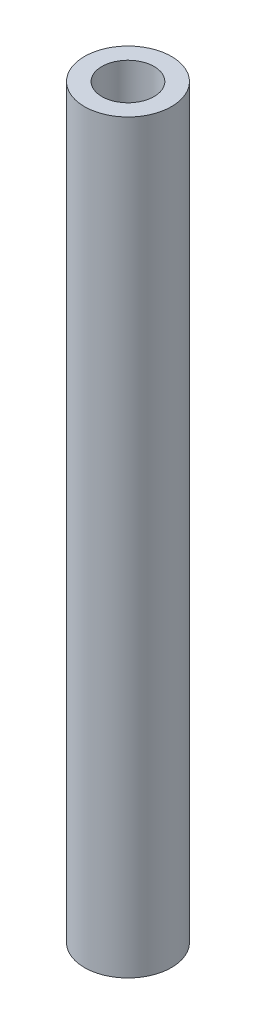
ISO-10303-21;
HEADER;
FILE_DESCRIPTION(('STEP AP214'),'2;1');
FILE_NAME('part.step','',(''),(''),'','','');
FILE_SCHEMA(('AUTOMOTIVE_DESIGN { 1 0 10303 214 1 1 1 1 }'));
ENDSEC;
DATA;
#1=APPLICATION_CONTEXT('core data for automotive mechanical design processes');
#2=APPLICATION_PROTOCOL_DEFINITION('international standard','automotive_design',2000,#1);
#3=PRODUCT_CONTEXT('',#1,'mechanical');
#4=PRODUCT('Part','Part','',(#3));
#5=PRODUCT_RELATED_PRODUCT_CATEGORY('part','',(#4));
#6=PRODUCT_DEFINITION_FORMATION('','',#4);
#7=PRODUCT_DEFINITION_CONTEXT('part definition',#1,'design');
#8=PRODUCT_DEFINITION('design','',#6,#7);
#9=PRODUCT_DEFINITION_SHAPE('','',#8);
#10=(LENGTH_UNIT() NAMED_UNIT(*) SI_UNIT(.MILLI.,.METRE.));
#11=(NAMED_UNIT(*) PLANE_ANGLE_UNIT() SI_UNIT($,.RADIAN.));
#12=(NAMED_UNIT(*) SI_UNIT($,.STERADIAN.) SOLID_ANGLE_UNIT());
#13=UNCERTAINTY_MEASURE_WITH_UNIT(LENGTH_MEASURE(1.E-05),#10,'distance_accuracy_value','');
#14=(GEOMETRIC_REPRESENTATION_CONTEXT(3) GLOBAL_UNCERTAINTY_ASSIGNED_CONTEXT((#13)) GLOBAL_UNIT_ASSIGNED_CONTEXT((#10,
#11,#12)) REPRESENTATION_CONTEXT('',''));
#15=CARTESIAN_POINT('',(0.,0.,0.));
#16=DIRECTION('',(0.,0.,1.));
#17=DIRECTION('',(1.,0.,0.));
#18=AXIS2_PLACEMENT_3D('',#15,#16,#17);
#19=CARTESIAN_POINT('',(0.,60.,0.));
#20=DIRECTION('',(0.,1.,0.));
#21=DIRECTION('',(0.,0.,1.));
#22=AXIS2_PLACEMENT_3D('',#19,#20,#21);
#23=PLANE('',#22);
#24=CARTESIAN_POINT('',(0.,60.,0.));
#25=DIRECTION('',(0.,1.,0.));
#26=DIRECTION('',(0.,0.,1.));
#27=AXIS2_PLACEMENT_3D('',#24,#25,#26);
#28=CIRCLE('',#27,3.5);
#29=CARTESIAN_POINT('',(0.,60.,3.5));
#30=VERTEX_POINT('',#29);
#31=EDGE_CURVE('E10',#30,#30,#28,.T.);
#32=ORIENTED_EDGE('',*,*,#31,.T.);
#33=EDGE_LOOP('',(#32));
#34=FACE_BOUND('',#33,.T.);
#35=CARTESIAN_POINT('',(0.,60.,0.));
#36=DIRECTION('',(0.,1.,0.));
#37=DIRECTION('',(0.,0.,1.));
#38=AXIS2_PLACEMENT_3D('',#35,#36,#37);
#39=CIRCLE('',#38,2.1);
#40=CARTESIAN_POINT('',(0.,60.,2.1));
#41=VERTEX_POINT('',#40);
#42=EDGE_CURVE('E49',#41,#41,#39,.T.);
#43=ORIENTED_EDGE('',*,*,#42,.F.);
#44=EDGE_LOOP('',(#43));
#45=FACE_BOUND('',#44,.T.);
#46=ADVANCED_FACE('F38',(#34,#45),#23,.T.);
#47=CARTESIAN_POINT('',(0.,0.,0.));
#48=DIRECTION('',(0.,1.,0.));
#49=DIRECTION('',(0.,0.,1.));
#50=AXIS2_PLACEMENT_3D('',#47,#48,#49);
#51=PLANE('',#50);
#52=CARTESIAN_POINT('',(0.,0.,0.));
#53=DIRECTION('',(0.,1.,0.));
#54=DIRECTION('',(0.,0.,1.));
#55=AXIS2_PLACEMENT_3D('',#52,#53,#54);
#56=CIRCLE('',#55,3.5);
#57=CARTESIAN_POINT('',(0.,0.,3.5));
#58=VERTEX_POINT('',#57);
#59=EDGE_CURVE('E42',#58,#58,#56,.T.);
#60=ORIENTED_EDGE('',*,*,#59,.F.);
#61=EDGE_LOOP('',(#60));
#62=FACE_BOUND('',#61,.T.);
#63=CARTESIAN_POINT('',(0.,0.,0.));
#64=DIRECTION('',(0.,1.,0.));
#65=DIRECTION('',(0.,0.,1.));
#66=AXIS2_PLACEMENT_3D('',#63,#64,#65);
#67=CIRCLE('',#66,2.1);
#68=CARTESIAN_POINT('',(0.,0.,2.1));
#69=VERTEX_POINT('',#68);
#70=EDGE_CURVE('E51',#69,#69,#67,.T.);
#71=ORIENTED_EDGE('',*,*,#70,.T.);
#72=EDGE_LOOP('',(#71));
#73=FACE_BOUND('',#72,.T.);
#74=ADVANCED_FACE('F61',(#62,#73),#51,.F.);
#75=CARTESIAN_POINT('',(0.,60.,0.));
#76=DIRECTION('',(0.,-1.,0.));
#77=DIRECTION('',(0.,0.,-1.));
#78=AXIS2_PLACEMENT_3D('',#75,#76,#77);
#79=CYLINDRICAL_SURFACE('',#78,3.5);
#80=ORIENTED_EDGE('',*,*,#31,.F.);
#81=EDGE_LOOP('',(#80));
#82=FACE_BOUND('',#81,.T.);
#83=ORIENTED_EDGE('',*,*,#59,.T.);
#84=EDGE_LOOP('',(#83));
#85=FACE_BOUND('',#84,.T.);
#86=ADVANCED_FACE('F40',(#82,#85),#79,.T.);
#87=CARTESIAN_POINT('',(0.,60.,0.));
#88=DIRECTION('',(0.,-1.,0.));
#89=DIRECTION('',(0.,0.,-1.));
#90=AXIS2_PLACEMENT_3D('',#87,#88,#89);
#91=CYLINDRICAL_SURFACE('',#90,2.1);
#92=ORIENTED_EDGE('',*,*,#42,.T.);
#93=EDGE_LOOP('',(#92));
#94=FACE_BOUND('',#93,.T.);
#95=ORIENTED_EDGE('',*,*,#70,.F.);
#96=EDGE_LOOP('',(#95));
#97=FACE_BOUND('',#96,.T.);
#98=ADVANCED_FACE('F57',(#94,#97),#91,.F.);
#99=CLOSED_SHELL('',(#46,#74,#86,#98));
#100=MANIFOLD_SOLID_BREP('B2',#99);
#101=ADVANCED_BREP_SHAPE_REPRESENTATION('',(#18,#100),#14);
#102=SHAPE_DEFINITION_REPRESENTATION(#9,#101);
ENDSEC;
END-ISO-10303-21;
